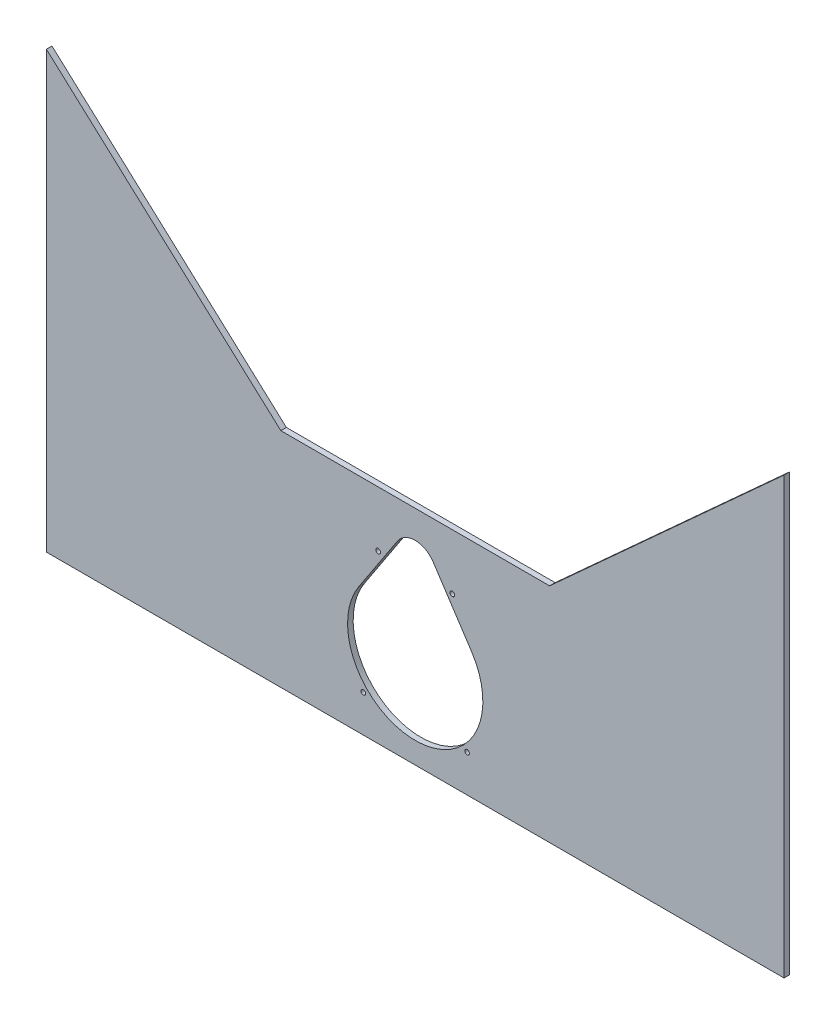
ISO-10303-21;
HEADER;
FILE_DESCRIPTION(('STEP AP214'),'2;1');
FILE_NAME('part.step','',(''),(''),'','','');
FILE_SCHEMA(('AUTOMOTIVE_DESIGN { 1 0 10303 214 1 1 1 1 }'));
ENDSEC;
DATA;
#1=APPLICATION_CONTEXT('core data for automotive mechanical design processes');
#2=APPLICATION_PROTOCOL_DEFINITION('international standard','automotive_design',2000,#1);
#3=PRODUCT_CONTEXT('',#1,'mechanical');
#4=PRODUCT('Part','Part','',(#3));
#5=PRODUCT_RELATED_PRODUCT_CATEGORY('part','',(#4));
#6=PRODUCT_DEFINITION_FORMATION('','',#4);
#7=PRODUCT_DEFINITION_CONTEXT('part definition',#1,'design');
#8=PRODUCT_DEFINITION('design','',#6,#7);
#9=PRODUCT_DEFINITION_SHAPE('','',#8);
#10=(LENGTH_UNIT() NAMED_UNIT(*) SI_UNIT(.MILLI.,.METRE.));
#11=(NAMED_UNIT(*) PLANE_ANGLE_UNIT() SI_UNIT($,.RADIAN.));
#12=(NAMED_UNIT(*) SI_UNIT($,.STERADIAN.) SOLID_ANGLE_UNIT());
#13=UNCERTAINTY_MEASURE_WITH_UNIT(LENGTH_MEASURE(1.E-05),#10,'distance_accuracy_value','');
#14=(GEOMETRIC_REPRESENTATION_CONTEXT(3) GLOBAL_UNCERTAINTY_ASSIGNED_CONTEXT((#13)) GLOBAL_UNIT_ASSIGNED_CONTEXT((#10,
#11,#12)) REPRESENTATION_CONTEXT('',''));
#15=CARTESIAN_POINT('',(0.,0.,0.));
#16=DIRECTION('',(0.,0.,1.));
#17=DIRECTION('',(1.,0.,0.));
#18=AXIS2_PLACEMENT_3D('',#15,#16,#17);
#19=CARTESIAN_POINT('',(0.,0.,3.));
#20=DIRECTION('',(0.,0.,1.));
#21=DIRECTION('',(1.,0.,0.));
#22=AXIS2_PLACEMENT_3D('',#19,#20,#21);
#23=PLANE('',#22);
#24=CARTESIAN_POINT('',(171.,20.,3.));
#25=DIRECTION('',(0.,0.,1.));
#26=DIRECTION('',(1.,0.,0.));
#27=AXIS2_PLACEMENT_3D('',#24,#25,#26);
#28=CIRCLE('',#27,1.25000000000001);
#29=CARTESIAN_POINT('',(172.25,20.,3.));
#30=VERTEX_POINT('',#29);
#31=EDGE_CURVE('E155',#30,#30,#28,.T.);
#32=ORIENTED_EDGE('',*,*,#31,.F.);
#33=EDGE_LOOP('',(#32));
#34=FACE_BOUND('',#33,.T.);
#35=CARTESIAN_POINT('',(227.,20.,3.));
#36=DIRECTION('',(0.,0.,1.));
#37=DIRECTION('',(1.,0.,0.));
#38=AXIS2_PLACEMENT_3D('',#35,#36,#37);
#39=CIRCLE('',#38,1.25000000000001);
#40=CARTESIAN_POINT('',(228.25,20.,3.));
#41=VERTEX_POINT('',#40);
#42=EDGE_CURVE('E167',#41,#41,#39,.T.);
#43=ORIENTED_EDGE('',*,*,#42,.F.);
#44=EDGE_LOOP('',(#43));
#45=FACE_BOUND('',#44,.T.);
#46=DIRECTION('',(0.,-1.,0.));
#47=VECTOR('',#46,1.);
#48=CARTESIAN_POINT('',(0.,235.,3.));
#49=LINE('',#48,#47);
#50=CARTESIAN_POINT('',(0.,235.,3.));
#51=VERTEX_POINT('',#50);
#52=CARTESIAN_POINT('',(0.,0.,3.));
#53=VERTEX_POINT('',#52);
#54=EDGE_CURVE('E173',#51,#53,#49,.T.);
#55=ORIENTED_EDGE('',*,*,#54,.T.);
#56=DIRECTION('',(1.,0.,0.));
#57=VECTOR('',#56,1.);
#58=CARTESIAN_POINT('',(0.,0.,3.));
#59=LINE('',#58,#57);
#60=CARTESIAN_POINT('',(398.,0.,3.));
#61=VERTEX_POINT('',#60);
#62=EDGE_CURVE('E176',#53,#61,#59,.T.);
#63=ORIENTED_EDGE('',*,*,#62,.T.);
#64=DIRECTION('',(0.,1.,0.));
#65=VECTOR('',#64,1.);
#66=CARTESIAN_POINT('',(398.,0.,3.));
#67=LINE('',#66,#65);
#68=CARTESIAN_POINT('',(398.,235.,3.));
#69=VERTEX_POINT('',#68);
#70=EDGE_CURVE('E179',#61,#69,#67,.T.);
#71=ORIENTED_EDGE('',*,*,#70,.T.);
#72=DIRECTION('',(-0.739940073395944,-0.672672793996312,0.));
#73=VECTOR('',#72,1.);
#74=CARTESIAN_POINT('',(398.,235.,3.));
#75=LINE('',#74,#73);
#76=CARTESIAN_POINT('',(271.5,120.,3.));
#77=VERTEX_POINT('',#76);
#78=EDGE_CURVE('E181',#69,#77,#75,.T.);
#79=ORIENTED_EDGE('',*,*,#78,.T.);
#80=DIRECTION('',(-1.,0.,0.));
#81=VECTOR('',#80,1.);
#82=CARTESIAN_POINT('',(271.5,120.,3.));
#83=LINE('',#82,#81);
#84=CARTESIAN_POINT('',(126.5,120.,3.));
#85=VERTEX_POINT('',#84);
#86=EDGE_CURVE('E183',#77,#85,#83,.T.);
#87=ORIENTED_EDGE('',*,*,#86,.T.);
#88=DIRECTION('',(-0.739940073395944,0.672672793996312,0.));
#89=VECTOR('',#88,1.);
#90=CARTESIAN_POINT('',(126.5,120.,3.));
#91=LINE('',#90,#89);
#92=EDGE_CURVE('E185',#85,#51,#91,.T.);
#93=ORIENTED_EDGE('',*,*,#92,.T.);
#94=EDGE_LOOP('',(#55,#63,#71,#79,#87,#93));
#95=FACE_BOUND('',#94,.T.);
#96=CARTESIAN_POINT('',(179.,90.,3.));
#97=DIRECTION('',(0.,0.,1.));
#98=DIRECTION('',(1.,0.,0.));
#99=AXIS2_PLACEMENT_3D('',#96,#97,#98);
#100=CIRCLE('',#99,1.25000000000001);
#101=CARTESIAN_POINT('',(180.25,90.,3.));
#102=VERTEX_POINT('',#101);
#103=EDGE_CURVE('E161',#102,#102,#100,.T.);
#104=ORIENTED_EDGE('',*,*,#103,.F.);
#105=EDGE_LOOP('',(#104));
#106=FACE_BOUND('',#105,.T.);
#107=CARTESIAN_POINT('',(219.,90.,3.));
#108=DIRECTION('',(0.,0.,1.));
#109=DIRECTION('',(1.,0.,0.));
#110=AXIS2_PLACEMENT_3D('',#107,#108,#109);
#111=CIRCLE('',#110,1.25000000000001);
#112=CARTESIAN_POINT('',(220.25,90.,3.));
#113=VERTEX_POINT('',#112);
#114=EDGE_CURVE('E149',#113,#113,#111,.T.);
#115=ORIENTED_EDGE('',*,*,#114,.F.);
#116=EDGE_LOOP('',(#115));
#117=FACE_BOUND('',#116,.T.);
#118=DIRECTION('',(-0.549450549450549,0.835526237594302,0.));
#119=VECTOR('',#118,1.);
#120=CARTESIAN_POINT('',(208.608551732334,99.8186813186813,3.));
#121=LINE('',#120,#119);
#122=CARTESIAN_POINT('',(229.496707672192,68.0549450549451,3.));
#123=VERTEX_POINT('',#122);
#124=CARTESIAN_POINT('',(208.608551732334,99.8186813186813,3.));
#125=VERTEX_POINT('',#124);
#126=EDGE_CURVE('E121',#123,#125,#121,.T.);
#127=ORIENTED_EDGE('',*,*,#126,.F.);
#128=CARTESIAN_POINT('',(199.,48.,3.));
#129=DIRECTION('',(0.,0.,1.));
#130=DIRECTION('',(1.,0.,0.));
#131=AXIS2_PLACEMENT_3D('',#128,#129,#130);
#132=CIRCLE('',#131,36.5);
#133=CARTESIAN_POINT('',(168.503292327808,68.0549450549451,3.));
#134=VERTEX_POINT('',#133);
#135=EDGE_CURVE('E113',#134,#123,#132,.T.);
#136=ORIENTED_EDGE('',*,*,#135,.F.);
#137=DIRECTION('',(-0.54945054945055,-0.835526237594301,0.));
#138=VECTOR('',#137,1.);
#139=CARTESIAN_POINT('',(168.503292327808,68.0549450549451,3.));
#140=LINE('',#139,#138);
#141=CARTESIAN_POINT('',(189.391448267665,99.8186813186813,3.));
#142=VERTEX_POINT('',#141);
#143=EDGE_CURVE('E135',#142,#134,#140,.T.);
#144=ORIENTED_EDGE('',*,*,#143,.F.);
#145=CARTESIAN_POINT('',(199.,93.5,3.));
#146=DIRECTION('',(0.,0.,1.));
#147=DIRECTION('',(1.,0.,0.));
#148=AXIS2_PLACEMENT_3D('',#145,#146,#147);
#149=CIRCLE('',#148,11.5);
#150=EDGE_CURVE('E133',#125,#142,#149,.T.);
#151=ORIENTED_EDGE('',*,*,#150,.F.);
#152=EDGE_LOOP('',(#127,#136,#144,#151));
#153=FACE_BOUND('',#152,.T.);
#154=ADVANCED_FACE('F36',(#34,#45,#95,#106,#117,#153),#23,.T.);
#155=CARTESIAN_POINT('',(0.,0.,0.));
#156=DIRECTION('',(0.,0.,1.));
#157=DIRECTION('',(1.,0.,0.));
#158=AXIS2_PLACEMENT_3D('',#155,#156,#157);
#159=PLANE('',#158);
#160=CARTESIAN_POINT('',(219.,90.,0.));
#161=DIRECTION('',(0.,0.,1.));
#162=DIRECTION('',(1.,0.,0.));
#163=AXIS2_PLACEMENT_3D('',#160,#161,#162);
#164=CIRCLE('',#163,1.25000000000001);
#165=CARTESIAN_POINT('',(220.25,90.,0.));
#166=VERTEX_POINT('',#165);
#167=EDGE_CURVE('E129',#166,#166,#164,.T.);
#168=ORIENTED_EDGE('',*,*,#167,.T.);
#169=EDGE_LOOP('',(#168));
#170=FACE_BOUND('',#169,.T.);
#171=CARTESIAN_POINT('',(171.,20.,0.));
#172=DIRECTION('',(0.,0.,1.));
#173=DIRECTION('',(1.,0.,0.));
#174=AXIS2_PLACEMENT_3D('',#171,#172,#173);
#175=CIRCLE('',#174,1.25000000000001);
#176=CARTESIAN_POINT('',(172.25,20.,0.));
#177=VERTEX_POINT('',#176);
#178=EDGE_CURVE('E152',#177,#177,#175,.T.);
#179=ORIENTED_EDGE('',*,*,#178,.T.);
#180=EDGE_LOOP('',(#179));
#181=FACE_BOUND('',#180,.T.);
#182=CARTESIAN_POINT('',(179.,90.,0.));
#183=DIRECTION('',(0.,0.,1.));
#184=DIRECTION('',(1.,0.,0.));
#185=AXIS2_PLACEMENT_3D('',#182,#183,#184);
#186=CIRCLE('',#185,1.25000000000001);
#187=CARTESIAN_POINT('',(180.25,90.,0.));
#188=VERTEX_POINT('',#187);
#189=EDGE_CURVE('E158',#188,#188,#186,.T.);
#190=ORIENTED_EDGE('',*,*,#189,.T.);
#191=EDGE_LOOP('',(#190));
#192=FACE_BOUND('',#191,.T.);
#193=CARTESIAN_POINT('',(227.,20.,0.));
#194=DIRECTION('',(0.,0.,1.));
#195=DIRECTION('',(1.,0.,0.));
#196=AXIS2_PLACEMENT_3D('',#193,#194,#195);
#197=CIRCLE('',#196,1.25000000000001);
#198=CARTESIAN_POINT('',(228.25,20.,0.));
#199=VERTEX_POINT('',#198);
#200=EDGE_CURVE('E164',#199,#199,#197,.T.);
#201=ORIENTED_EDGE('',*,*,#200,.T.);
#202=EDGE_LOOP('',(#201));
#203=FACE_BOUND('',#202,.T.);
#204=DIRECTION('',(0.,-1.,0.));
#205=VECTOR('',#204,1.);
#206=CARTESIAN_POINT('',(0.,235.,0.));
#207=LINE('',#206,#205);
#208=CARTESIAN_POINT('',(0.,235.,0.));
#209=VERTEX_POINT('',#208);
#210=CARTESIAN_POINT('',(0.,0.,0.));
#211=VERTEX_POINT('',#210);
#212=EDGE_CURVE('E170',#209,#211,#207,.T.);
#213=ORIENTED_EDGE('',*,*,#212,.F.);
#214=DIRECTION('',(-0.739940073395944,0.672672793996312,0.));
#215=VECTOR('',#214,1.);
#216=CARTESIAN_POINT('',(126.5,120.,0.));
#217=LINE('',#216,#215);
#218=CARTESIAN_POINT('',(126.5,120.,0.));
#219=VERTEX_POINT('',#218);
#220=EDGE_CURVE('E177',#219,#209,#217,.T.);
#221=ORIENTED_EDGE('',*,*,#220,.F.);
#222=DIRECTION('',(-1.,0.,0.));
#223=VECTOR('',#222,1.);
#224=CARTESIAN_POINT('',(271.5,120.,0.));
#225=LINE('',#224,#223);
#226=CARTESIAN_POINT('',(271.5,120.,0.));
#227=VERTEX_POINT('',#226);
#228=EDGE_CURVE('E196',#227,#219,#225,.T.);
#229=ORIENTED_EDGE('',*,*,#228,.F.);
#230=DIRECTION('',(-0.739940073395944,-0.672672793996312,0.));
#231=VECTOR('',#230,1.);
#232=CARTESIAN_POINT('',(398.,235.,0.));
#233=LINE('',#232,#231);
#234=CARTESIAN_POINT('',(398.,235.,0.));
#235=VERTEX_POINT('',#234);
#236=EDGE_CURVE('E194',#235,#227,#233,.T.);
#237=ORIENTED_EDGE('',*,*,#236,.F.);
#238=DIRECTION('',(0.,1.,0.));
#239=VECTOR('',#238,1.);
#240=CARTESIAN_POINT('',(398.,0.,0.));
#241=LINE('',#240,#239);
#242=CARTESIAN_POINT('',(398.,0.,0.));
#243=VERTEX_POINT('',#242);
#244=EDGE_CURVE('E192',#243,#235,#241,.T.);
#245=ORIENTED_EDGE('',*,*,#244,.F.);
#246=DIRECTION('',(1.,0.,0.));
#247=VECTOR('',#246,1.);
#248=CARTESIAN_POINT('',(0.,0.,0.));
#249=LINE('',#248,#247);
#250=EDGE_CURVE('E190',#211,#243,#249,.T.);
#251=ORIENTED_EDGE('',*,*,#250,.F.);
#252=EDGE_LOOP('',(#213,#221,#229,#237,#245,#251));
#253=FACE_BOUND('',#252,.T.);
#254=CARTESIAN_POINT('',(199.,48.,0.));
#255=DIRECTION('',(0.,0.,1.));
#256=DIRECTION('',(1.,0.,0.));
#257=AXIS2_PLACEMENT_3D('',#254,#255,#256);
#258=CIRCLE('',#257,36.5);
#259=CARTESIAN_POINT('',(168.503292327808,68.0549450549451,0.));
#260=VERTEX_POINT('',#259);
#261=CARTESIAN_POINT('',(229.496707672192,68.0549450549451,0.));
#262=VERTEX_POINT('',#261);
#263=EDGE_CURVE('E59',#260,#262,#258,.T.);
#264=ORIENTED_EDGE('',*,*,#263,.T.);
#265=DIRECTION('',(-0.549450549450549,0.835526237594302,0.));
#266=VECTOR('',#265,1.);
#267=CARTESIAN_POINT('',(208.608551732334,99.8186813186813,0.));
#268=LINE('',#267,#266);
#269=CARTESIAN_POINT('',(208.608551732334,99.8186813186813,0.));
#270=VERTEX_POINT('',#269);
#271=EDGE_CURVE('E128',#262,#270,#268,.T.);
#272=ORIENTED_EDGE('',*,*,#271,.T.);
#273=CARTESIAN_POINT('',(199.,93.5,0.));
#274=DIRECTION('',(0.,0.,1.));
#275=DIRECTION('',(1.,0.,0.));
#276=AXIS2_PLACEMENT_3D('',#273,#274,#275);
#277=CIRCLE('',#276,11.5);
#278=CARTESIAN_POINT('',(189.391448267665,99.8186813186813,0.));
#279=VERTEX_POINT('',#278);
#280=EDGE_CURVE('E141',#270,#279,#277,.T.);
#281=ORIENTED_EDGE('',*,*,#280,.T.);
#282=DIRECTION('',(-0.54945054945055,-0.835526237594301,0.));
#283=VECTOR('',#282,1.);
#284=CARTESIAN_POINT('',(168.503292327808,68.0549450549451,0.));
#285=LINE('',#284,#283);
#286=EDGE_CURVE('E122',#279,#260,#285,.T.);
#287=ORIENTED_EDGE('',*,*,#286,.T.);
#288=EDGE_LOOP('',(#264,#272,#281,#287));
#289=FACE_BOUND('',#288,.T.);
#290=ADVANCED_FACE('F220',(#170,#181,#192,#203,#253,#289),#159,.F.);
#291=CARTESIAN_POINT('',(0.,235.,3.));
#292=DIRECTION('',(1.,0.,0.));
#293=DIRECTION('',(0.,0.,-1.));
#294=AXIS2_PLACEMENT_3D('',#291,#292,#293);
#295=PLANE('',#294);
#296=ORIENTED_EDGE('',*,*,#212,.T.);
#297=DIRECTION('',(0.,0.,-1.));
#298=VECTOR('',#297,1.);
#299=CARTESIAN_POINT('',(0.,0.,3.));
#300=LINE('',#299,#298);
#301=EDGE_CURVE('E11',#53,#211,#300,.T.);
#302=ORIENTED_EDGE('',*,*,#301,.F.);
#303=ORIENTED_EDGE('',*,*,#54,.F.);
#304=DIRECTION('',(0.,0.,-1.));
#305=VECTOR('',#304,1.);
#306=CARTESIAN_POINT('',(0.,235.,3.));
#307=LINE('',#306,#305);
#308=EDGE_CURVE('E187',#51,#209,#307,.T.);
#309=ORIENTED_EDGE('',*,*,#308,.T.);
#310=EDGE_LOOP('',(#296,#302,#303,#309));
#311=FACE_BOUND('',#310,.T.);
#312=ADVANCED_FACE('F38',(#311),#295,.F.);
#313=CARTESIAN_POINT('',(0.,0.,3.));
#314=DIRECTION('',(0.,1.,0.));
#315=DIRECTION('',(0.,0.,1.));
#316=AXIS2_PLACEMENT_3D('',#313,#314,#315);
#317=PLANE('',#316);
#318=ORIENTED_EDGE('',*,*,#250,.T.);
#319=DIRECTION('',(0.,0.,-1.));
#320=VECTOR('',#319,1.);
#321=CARTESIAN_POINT('',(398.,0.,3.));
#322=LINE('',#321,#320);
#323=EDGE_CURVE('E44',#61,#243,#322,.T.);
#324=ORIENTED_EDGE('',*,*,#323,.F.);
#325=ORIENTED_EDGE('',*,*,#62,.F.);
#326=ORIENTED_EDGE('',*,*,#301,.T.);
#327=EDGE_LOOP('',(#318,#324,#325,#326));
#328=FACE_BOUND('',#327,.T.);
#329=ADVANCED_FACE('F238',(#328),#317,.F.);
#330=CARTESIAN_POINT('',(398.,0.,3.));
#331=DIRECTION('',(-1.,0.,0.));
#332=DIRECTION('',(0.,0.,1.));
#333=AXIS2_PLACEMENT_3D('',#330,#331,#332);
#334=PLANE('',#333);
#335=ORIENTED_EDGE('',*,*,#244,.T.);
#336=DIRECTION('',(0.,0.,-1.));
#337=VECTOR('',#336,1.);
#338=CARTESIAN_POINT('',(398.,235.,3.));
#339=LINE('',#338,#337);
#340=EDGE_CURVE('E207',#69,#235,#339,.T.);
#341=ORIENTED_EDGE('',*,*,#340,.F.);
#342=ORIENTED_EDGE('',*,*,#70,.F.);
#343=ORIENTED_EDGE('',*,*,#323,.T.);
#344=EDGE_LOOP('',(#335,#341,#342,#343));
#345=FACE_BOUND('',#344,.T.);
#346=ADVANCED_FACE('F214',(#345),#334,.F.);
#347=CARTESIAN_POINT('',(398.,235.,3.));
#348=DIRECTION('',(0.672672793996312,-0.739940073395944,0.));
#349=DIRECTION('',(0.739940073395944,0.672672793996312,0.));
#350=AXIS2_PLACEMENT_3D('',#347,#348,#349);
#351=PLANE('',#350);
#352=ORIENTED_EDGE('',*,*,#236,.T.);
#353=DIRECTION('',(0.,0.,-1.));
#354=VECTOR('',#353,1.);
#355=CARTESIAN_POINT('',(271.5,120.,3.));
#356=LINE('',#355,#354);
#357=EDGE_CURVE('E204',#77,#227,#356,.T.);
#358=ORIENTED_EDGE('',*,*,#357,.F.);
#359=ORIENTED_EDGE('',*,*,#78,.F.);
#360=ORIENTED_EDGE('',*,*,#340,.T.);
#361=EDGE_LOOP('',(#352,#358,#359,#360));
#362=FACE_BOUND('',#361,.T.);
#363=ADVANCED_FACE('F226',(#362),#351,.F.);
#364=CARTESIAN_POINT('',(271.5,120.,3.));
#365=DIRECTION('',(0.,-1.,0.));
#366=DIRECTION('',(0.,0.,-1.));
#367=AXIS2_PLACEMENT_3D('',#364,#365,#366);
#368=PLANE('',#367);
#369=ORIENTED_EDGE('',*,*,#228,.T.);
#370=DIRECTION('',(0.,0.,-1.));
#371=VECTOR('',#370,1.);
#372=CARTESIAN_POINT('',(126.5,120.,3.));
#373=LINE('',#372,#371);
#374=EDGE_CURVE('E201',#85,#219,#373,.T.);
#375=ORIENTED_EDGE('',*,*,#374,.F.);
#376=ORIENTED_EDGE('',*,*,#86,.F.);
#377=ORIENTED_EDGE('',*,*,#357,.T.);
#378=EDGE_LOOP('',(#369,#375,#376,#377));
#379=FACE_BOUND('',#378,.T.);
#380=ADVANCED_FACE('F230',(#379),#368,.F.);
#381=CARTESIAN_POINT('',(126.5,120.,3.));
#382=DIRECTION('',(-0.672672793996312,-0.739940073395944,0.));
#383=DIRECTION('',(0.739940073395944,-0.672672793996312,0.));
#384=AXIS2_PLACEMENT_3D('',#381,#382,#383);
#385=PLANE('',#384);
#386=ORIENTED_EDGE('',*,*,#220,.T.);
#387=ORIENTED_EDGE('',*,*,#308,.F.);
#388=ORIENTED_EDGE('',*,*,#92,.F.);
#389=ORIENTED_EDGE('',*,*,#374,.T.);
#390=EDGE_LOOP('',(#386,#387,#388,#389));
#391=FACE_BOUND('',#390,.T.);
#392=ADVANCED_FACE('F241',(#391),#385,.F.);
#393=CARTESIAN_POINT('',(227.,20.,3.));
#394=DIRECTION('',(0.,0.,-1.));
#395=DIRECTION('',(-1.,0.,0.));
#396=AXIS2_PLACEMENT_3D('',#393,#394,#395);
#397=CYLINDRICAL_SURFACE('',#396,1.25000000000001);
#398=ORIENTED_EDGE('',*,*,#42,.T.);
#399=EDGE_LOOP('',(#398));
#400=FACE_BOUND('',#399,.T.);
#401=ORIENTED_EDGE('',*,*,#200,.F.);
#402=EDGE_LOOP('',(#401));
#403=FACE_BOUND('',#402,.T.);
#404=ADVANCED_FACE('F243',(#400,#403),#397,.F.);
#405=CARTESIAN_POINT('',(179.,90.,3.));
#406=DIRECTION('',(0.,0.,-1.));
#407=DIRECTION('',(-1.,0.,0.));
#408=AXIS2_PLACEMENT_3D('',#405,#406,#407);
#409=CYLINDRICAL_SURFACE('',#408,1.25000000000001);
#410=ORIENTED_EDGE('',*,*,#103,.T.);
#411=EDGE_LOOP('',(#410));
#412=FACE_BOUND('',#411,.T.);
#413=ORIENTED_EDGE('',*,*,#189,.F.);
#414=EDGE_LOOP('',(#413));
#415=FACE_BOUND('',#414,.T.);
#416=ADVANCED_FACE('F249',(#412,#415),#409,.F.);
#417=CARTESIAN_POINT('',(171.,20.,3.));
#418=DIRECTION('',(0.,0.,-1.));
#419=DIRECTION('',(-1.,0.,0.));
#420=AXIS2_PLACEMENT_3D('',#417,#418,#419);
#421=CYLINDRICAL_SURFACE('',#420,1.25000000000001);
#422=ORIENTED_EDGE('',*,*,#31,.T.);
#423=EDGE_LOOP('',(#422));
#424=FACE_BOUND('',#423,.T.);
#425=ORIENTED_EDGE('',*,*,#178,.F.);
#426=EDGE_LOOP('',(#425));
#427=FACE_BOUND('',#426,.T.);
#428=ADVANCED_FACE('F266',(#424,#427),#421,.F.);
#429=CARTESIAN_POINT('',(219.,90.,3.));
#430=DIRECTION('',(0.,0.,-1.));
#431=DIRECTION('',(-1.,0.,0.));
#432=AXIS2_PLACEMENT_3D('',#429,#430,#431);
#433=CYLINDRICAL_SURFACE('',#432,1.25000000000001);
#434=ORIENTED_EDGE('',*,*,#114,.T.);
#435=EDGE_LOOP('',(#434));
#436=FACE_BOUND('',#435,.T.);
#437=ORIENTED_EDGE('',*,*,#167,.F.);
#438=EDGE_LOOP('',(#437));
#439=FACE_BOUND('',#438,.T.);
#440=ADVANCED_FACE('F270',(#436,#439),#433,.F.);
#441=CARTESIAN_POINT('',(199.,48.,3.));
#442=DIRECTION('',(0.,0.,-1.));
#443=DIRECTION('',(-1.,0.,0.));
#444=AXIS2_PLACEMENT_3D('',#441,#442,#443);
#445=CYLINDRICAL_SURFACE('',#444,36.5);
#446=ORIENTED_EDGE('',*,*,#263,.F.);
#447=DIRECTION('',(0.,0.,-1.));
#448=VECTOR('',#447,1.);
#449=CARTESIAN_POINT('',(168.503292327808,68.0549450549451,3.));
#450=LINE('',#449,#448);
#451=EDGE_CURVE('E117',#134,#260,#450,.T.);
#452=ORIENTED_EDGE('',*,*,#451,.F.);
#453=ORIENTED_EDGE('',*,*,#135,.T.);
#454=DIRECTION('',(0.,0.,-1.));
#455=VECTOR('',#454,1.);
#456=CARTESIAN_POINT('',(229.496707672192,68.0549450549451,3.));
#457=LINE('',#456,#455);
#458=EDGE_CURVE('E116',#123,#262,#457,.T.);
#459=ORIENTED_EDGE('',*,*,#458,.T.);
#460=EDGE_LOOP('',(#446,#452,#453,#459));
#461=FACE_BOUND('',#460,.T.);
#462=ADVANCED_FACE('F115',(#461),#445,.F.);
#463=CARTESIAN_POINT('',(208.608551732334,99.8186813186813,3.));
#464=DIRECTION('',(-0.835526237594302,-0.549450549450549,0.));
#465=DIRECTION('',(0.549450549450549,-0.835526237594302,0.));
#466=AXIS2_PLACEMENT_3D('',#463,#464,#465);
#467=PLANE('',#466);
#468=ORIENTED_EDGE('',*,*,#271,.F.);
#469=ORIENTED_EDGE('',*,*,#458,.F.);
#470=ORIENTED_EDGE('',*,*,#126,.T.);
#471=DIRECTION('',(0.,0.,-1.));
#472=VECTOR('',#471,1.);
#473=CARTESIAN_POINT('',(208.608551732334,99.8186813186813,3.));
#474=LINE('',#473,#472);
#475=EDGE_CURVE('E130',#125,#270,#474,.T.);
#476=ORIENTED_EDGE('',*,*,#475,.T.);
#477=EDGE_LOOP('',(#468,#469,#470,#476));
#478=FACE_BOUND('',#477,.T.);
#479=ADVANCED_FACE('F125',(#478),#467,.T.);
#480=CARTESIAN_POINT('',(199.,93.5,3.));
#481=DIRECTION('',(0.,0.,-1.));
#482=DIRECTION('',(-1.,0.,0.));
#483=AXIS2_PLACEMENT_3D('',#480,#481,#482);
#484=CYLINDRICAL_SURFACE('',#483,11.5);
#485=ORIENTED_EDGE('',*,*,#280,.F.);
#486=ORIENTED_EDGE('',*,*,#475,.F.);
#487=ORIENTED_EDGE('',*,*,#150,.T.);
#488=DIRECTION('',(0.,0.,-1.));
#489=VECTOR('',#488,1.);
#490=CARTESIAN_POINT('',(189.391448267665,99.8186813186813,3.));
#491=LINE('',#490,#489);
#492=EDGE_CURVE('E51',#142,#279,#491,.T.);
#493=ORIENTED_EDGE('',*,*,#492,.T.);
#494=EDGE_LOOP('',(#485,#486,#487,#493));
#495=FACE_BOUND('',#494,.T.);
#496=ADVANCED_FACE('F279',(#495),#484,.F.);
#497=CARTESIAN_POINT('',(168.503292327808,68.0549450549451,3.));
#498=DIRECTION('',(0.835526237594301,-0.54945054945055,0.));
#499=DIRECTION('',(0.54945054945055,0.835526237594301,0.));
#500=AXIS2_PLACEMENT_3D('',#497,#498,#499);
#501=PLANE('',#500);
#502=ORIENTED_EDGE('',*,*,#286,.F.);
#503=ORIENTED_EDGE('',*,*,#492,.F.);
#504=ORIENTED_EDGE('',*,*,#143,.T.);
#505=ORIENTED_EDGE('',*,*,#451,.T.);
#506=EDGE_LOOP('',(#502,#503,#504,#505));
#507=FACE_BOUND('',#506,.T.);
#508=ADVANCED_FACE('F282',(#507),#501,.T.);
#509=CLOSED_SHELL('',(#154,#290,#312,#329,#346,#363,#380,#392,#404,#416,#428,#440,#462,#479,
#496,#508));
#510=MANIFOLD_SOLID_BREP('B2',#509);
#511=ADVANCED_BREP_SHAPE_REPRESENTATION('',(#18,#510),#14);
#512=SHAPE_DEFINITION_REPRESENTATION(#9,#511);
ENDSEC;
END-ISO-10303-21;
